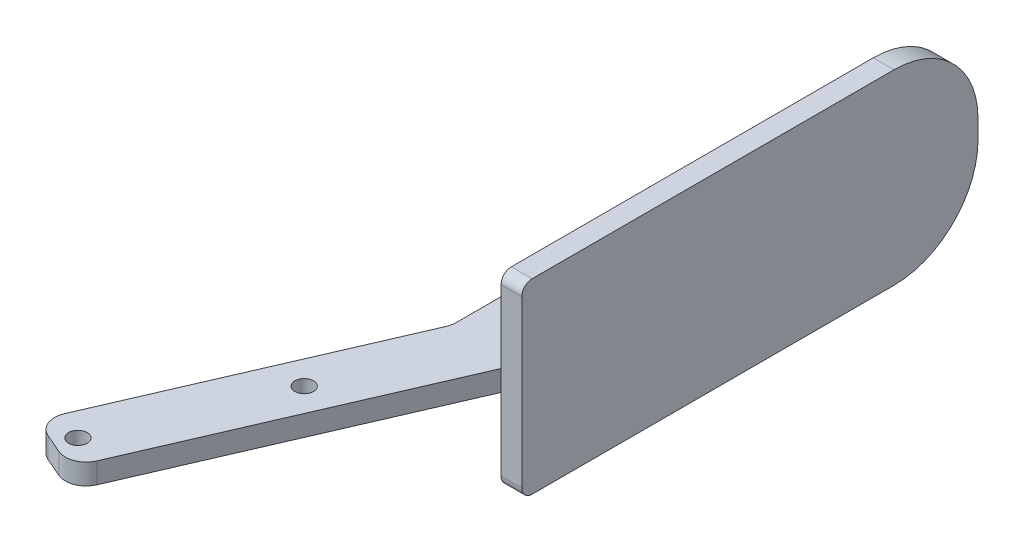
ISO-10303-21;
HEADER;
FILE_DESCRIPTION(('STEP AP214'),'2;1');
FILE_NAME('part.step','',(''),(''),'','','');
FILE_SCHEMA(('AUTOMOTIVE_DESIGN { 1 0 10303 214 1 1 1 1 }'));
ENDSEC;
DATA;
#1=APPLICATION_CONTEXT('core data for automotive mechanical design processes');
#2=APPLICATION_PROTOCOL_DEFINITION('international standard','automotive_design',2000,#1);
#3=PRODUCT_CONTEXT('',#1,'mechanical');
#4=PRODUCT('Part','Part','',(#3));
#5=PRODUCT_RELATED_PRODUCT_CATEGORY('part','',(#4));
#6=PRODUCT_DEFINITION_FORMATION('','',#4);
#7=PRODUCT_DEFINITION_CONTEXT('part definition',#1,'design');
#8=PRODUCT_DEFINITION('design','',#6,#7);
#9=PRODUCT_DEFINITION_SHAPE('','',#8);
#10=(LENGTH_UNIT() NAMED_UNIT(*) SI_UNIT(.MILLI.,.METRE.));
#11=(NAMED_UNIT(*) PLANE_ANGLE_UNIT() SI_UNIT($,.RADIAN.));
#12=(NAMED_UNIT(*) SI_UNIT($,.STERADIAN.) SOLID_ANGLE_UNIT());
#13=UNCERTAINTY_MEASURE_WITH_UNIT(LENGTH_MEASURE(1.E-05),#10,'distance_accuracy_value','');
#14=(GEOMETRIC_REPRESENTATION_CONTEXT(3) GLOBAL_UNCERTAINTY_ASSIGNED_CONTEXT((#13)) GLOBAL_UNIT_ASSIGNED_CONTEXT((#10,
#11,#12)) REPRESENTATION_CONTEXT('',''));
#15=CARTESIAN_POINT('',(0.,0.,0.));
#16=DIRECTION('',(0.,0.,1.));
#17=DIRECTION('',(1.,0.,0.));
#18=AXIS2_PLACEMENT_3D('',#15,#16,#17);
#19=CARTESIAN_POINT('',(3.175,14.2875,0.));
#20=DIRECTION('',(0.,0.,-1.));
#21=DIRECTION('',(-1.,0.,0.));
#22=AXIS2_PLACEMENT_3D('',#19,#20,#21);
#23=PLANE('',#22);
#24=DIRECTION('',(0.,-1.,0.));
#25=VECTOR('',#24,1.);
#26=CARTESIAN_POINT('',(0.,14.2875,0.));
#27=LINE('',#26,#25);
#28=CARTESIAN_POINT('',(0.,-1.5875,0.));
#29=VERTEX_POINT('',#28);
#30=CARTESIAN_POINT('',(0.,-12.7,0.));
#31=VERTEX_POINT('',#30);
#32=EDGE_CURVE('E179',#29,#31,#27,.T.);
#33=ORIENTED_EDGE('',*,*,#32,.T.);
#34=DIRECTION('',(-1.,0.,0.));
#35=VECTOR('',#34,1.);
#36=CARTESIAN_POINT('',(3.175,-12.7,0.));
#37=LINE('',#36,#35);
#38=CARTESIAN_POINT('',(3.175,-12.7,0.));
#39=VERTEX_POINT('',#38);
#40=EDGE_CURVE('E311',#31,#39,#37,.F.);
#41=ORIENTED_EDGE('',*,*,#40,.T.);
#42=DIRECTION('',(0.,-1.,0.));
#43=VECTOR('',#42,1.);
#44=CARTESIAN_POINT('',(3.175,14.2875,0.));
#45=LINE('',#44,#43);
#46=CARTESIAN_POINT('',(3.175,12.7,0.));
#47=VERTEX_POINT('',#46);
#48=EDGE_CURVE('E277',#47,#39,#45,.T.);
#49=ORIENTED_EDGE('',*,*,#48,.F.);
#50=DIRECTION('',(-1.,0.,0.));
#51=VECTOR('',#50,1.);
#52=CARTESIAN_POINT('',(3.175,12.7,0.));
#53=LINE('',#52,#51);
#54=CARTESIAN_POINT('',(0.,12.7,0.));
#55=VERTEX_POINT('',#54);
#56=EDGE_CURVE('E309',#47,#55,#53,.T.);
#57=ORIENTED_EDGE('',*,*,#56,.T.);
#58=CARTESIAN_POINT('',(0.,1.5875,0.));
#59=VERTEX_POINT('',#58);
#60=EDGE_CURVE('E260',#55,#59,#27,.T.);
#61=ORIENTED_EDGE('',*,*,#60,.T.);
#62=DIRECTION('',(0.,-1.,0.));
#63=VECTOR('',#62,1.);
#64=CARTESIAN_POINT('',(0.,1.5875,0.));
#65=LINE('',#64,#63);
#66=EDGE_CURVE('E180',#59,#29,#65,.T.);
#67=ORIENTED_EDGE('',*,*,#66,.T.);
#68=EDGE_LOOP('',(#33,#41,#49,#57,#61,#67));
#69=FACE_BOUND('',#68,.T.);
#70=ADVANCED_FACE('F37',(#69),#23,.F.);
#71=CARTESIAN_POINT('',(3.175,-14.2875,0.));
#72=DIRECTION('',(0.,1.,0.));
#73=DIRECTION('',(0.,0.,1.));
#74=AXIS2_PLACEMENT_3D('',#71,#72,#73);
#75=PLANE('',#74);
#76=DIRECTION('',(0.,0.,-1.));
#77=VECTOR('',#76,1.);
#78=CARTESIAN_POINT('',(3.175,-14.2875,0.));
#79=LINE('',#78,#77);
#80=CARTESIAN_POINT('',(3.175,-14.2875,-1.5875));
#81=VERTEX_POINT('',#80);
#82=CARTESIAN_POINT('',(3.175,-14.2875,-56.9976));
#83=VERTEX_POINT('',#82);
#84=EDGE_CURVE('E364',#81,#83,#79,.T.);
#85=ORIENTED_EDGE('',*,*,#84,.F.);
#86=DIRECTION('',(-1.,0.,0.));
#87=VECTOR('',#86,1.);
#88=CARTESIAN_POINT('',(3.175,-14.2875,-1.5875));
#89=LINE('',#88,#87);
#90=CARTESIAN_POINT('',(0.,-14.2875,-1.5875));
#91=VERTEX_POINT('',#90);
#92=EDGE_CURVE('E255',#81,#91,#89,.T.);
#93=ORIENTED_EDGE('',*,*,#92,.T.);
#94=DIRECTION('',(0.,0.,-1.));
#95=VECTOR('',#94,1.);
#96=CARTESIAN_POINT('',(0.,-14.2875,0.));
#97=LINE('',#96,#95);
#98=CARTESIAN_POINT('',(0.,-14.2875,-56.9976));
#99=VERTEX_POINT('',#98);
#100=EDGE_CURVE('E262',#91,#99,#97,.T.);
#101=ORIENTED_EDGE('',*,*,#100,.T.);
#102=DIRECTION('',(-1.,0.,0.));
#103=VECTOR('',#102,1.);
#104=CARTESIAN_POINT('',(3.175,-14.2875,-56.9976));
#105=LINE('',#104,#103);
#106=EDGE_CURVE('E288',#99,#83,#105,.F.);
#107=ORIENTED_EDGE('',*,*,#106,.T.);
#108=EDGE_LOOP('',(#85,#93,#101,#107));
#109=FACE_BOUND('',#108,.T.);
#110=ADVANCED_FACE('F382',(#109),#75,.F.);
#111=CARTESIAN_POINT('',(3.175,14.2875,-69.85));
#112=DIRECTION('',(0.,0.,1.));
#113=DIRECTION('',(1.,0.,0.));
#114=AXIS2_PLACEMENT_3D('',#111,#112,#113);
#115=PLANE('',#114);
#116=DIRECTION('',(0.,1.,0.));
#117=VECTOR('',#116,1.);
#118=CARTESIAN_POINT('',(3.175,14.2875,-69.85));
#119=LINE('',#118,#117);
#120=CARTESIAN_POINT('',(3.175,-1.4351,-69.85));
#121=VERTEX_POINT('',#120);
#122=CARTESIAN_POINT('',(3.175,1.4351,-69.85));
#123=VERTEX_POINT('',#122);
#124=EDGE_CURVE('E365',#121,#123,#119,.T.);
#125=ORIENTED_EDGE('',*,*,#124,.F.);
#126=DIRECTION('',(-1.,0.,0.));
#127=VECTOR('',#126,1.);
#128=CARTESIAN_POINT('',(3.175,-1.4351,-69.85));
#129=LINE('',#128,#127);
#130=CARTESIAN_POINT('',(0.,-1.4351,-69.85));
#131=VERTEX_POINT('',#130);
#132=EDGE_CURVE('E280',#121,#131,#129,.T.);
#133=ORIENTED_EDGE('',*,*,#132,.T.);
#134=DIRECTION('',(0.,1.,0.));
#135=VECTOR('',#134,1.);
#136=CARTESIAN_POINT('',(0.,14.2875,-69.85));
#137=LINE('',#136,#135);
#138=CARTESIAN_POINT('',(0.,1.4351,-69.85));
#139=VERTEX_POINT('',#138);
#140=EDGE_CURVE('E271',#131,#139,#137,.T.);
#141=ORIENTED_EDGE('',*,*,#140,.T.);
#142=DIRECTION('',(-1.,0.,0.));
#143=VECTOR('',#142,1.);
#144=CARTESIAN_POINT('',(3.175,1.4351,-69.85));
#145=LINE('',#144,#143);
#146=EDGE_CURVE('E278',#139,#123,#145,.F.);
#147=ORIENTED_EDGE('',*,*,#146,.T.);
#148=EDGE_LOOP('',(#125,#133,#141,#147));
#149=FACE_BOUND('',#148,.T.);
#150=ADVANCED_FACE('F389',(#149),#115,.F.);
#151=CARTESIAN_POINT('',(3.175,14.2875,0.));
#152=DIRECTION('',(0.,-1.,0.));
#153=DIRECTION('',(0.,0.,-1.));
#154=AXIS2_PLACEMENT_3D('',#151,#152,#153);
#155=PLANE('',#154);
#156=DIRECTION('',(0.,0.,1.));
#157=VECTOR('',#156,1.);
#158=CARTESIAN_POINT('',(0.,14.2875,0.));
#159=LINE('',#158,#157);
#160=CARTESIAN_POINT('',(0.,14.2875,-56.9976));
#161=VERTEX_POINT('',#160);
#162=CARTESIAN_POINT('',(0.,14.2875,-1.5875));
#163=VERTEX_POINT('',#162);
#164=EDGE_CURVE('E274',#161,#163,#159,.T.);
#165=ORIENTED_EDGE('',*,*,#164,.T.);
#166=DIRECTION('',(-1.,0.,0.));
#167=VECTOR('',#166,1.);
#168=CARTESIAN_POINT('',(3.175,14.2875,-1.5875));
#169=LINE('',#168,#167);
#170=CARTESIAN_POINT('',(3.175,14.2875,-1.5875));
#171=VERTEX_POINT('',#170);
#172=EDGE_CURVE('E319',#163,#171,#169,.F.);
#173=ORIENTED_EDGE('',*,*,#172,.T.);
#174=DIRECTION('',(0.,0.,1.));
#175=VECTOR('',#174,1.);
#176=CARTESIAN_POINT('',(3.175,14.2875,0.));
#177=LINE('',#176,#175);
#178=CARTESIAN_POINT('',(3.175,14.2875,-56.9976));
#179=VERTEX_POINT('',#178);
#180=EDGE_CURVE('E267',#179,#171,#177,.T.);
#181=ORIENTED_EDGE('',*,*,#180,.F.);
#182=DIRECTION('',(-1.,0.,0.));
#183=VECTOR('',#182,1.);
#184=CARTESIAN_POINT('',(3.175,14.2875,-56.9976));
#185=LINE('',#184,#183);
#186=EDGE_CURVE('E259',#179,#161,#185,.T.);
#187=ORIENTED_EDGE('',*,*,#186,.T.);
#188=EDGE_LOOP('',(#165,#173,#181,#187));
#189=FACE_BOUND('',#188,.T.);
#190=ADVANCED_FACE('F299',(#189),#155,.F.);
#191=CARTESIAN_POINT('',(3.175,-14.2875,0.));
#192=DIRECTION('',(1.,0.,0.));
#193=DIRECTION('',(0.,0.,-1.));
#194=AXIS2_PLACEMENT_3D('',#191,#192,#193);
#195=PLANE('',#194);
#196=ORIENTED_EDGE('',*,*,#48,.T.);
#197=CARTESIAN_POINT('',(3.175,-12.7,-1.5875));
#198=DIRECTION('',(1.,0.,0.));
#199=DIRECTION('',(0.,0.,-1.));
#200=AXIS2_PLACEMENT_3D('',#197,#198,#199);
#201=CIRCLE('',#200,1.5875);
#202=EDGE_CURVE('E317',#39,#81,#201,.T.);
#203=ORIENTED_EDGE('',*,*,#202,.T.);
#204=ORIENTED_EDGE('',*,*,#84,.T.);
#205=CARTESIAN_POINT('',(3.175,-1.4351,-56.9976));
#206=DIRECTION('',(1.,0.,0.));
#207=DIRECTION('',(0.,0.,-1.));
#208=AXIS2_PLACEMENT_3D('',#205,#206,#207);
#209=CIRCLE('',#208,12.8524);
#210=EDGE_CURVE('E293',#83,#121,#209,.T.);
#211=ORIENTED_EDGE('',*,*,#210,.T.);
#212=ORIENTED_EDGE('',*,*,#124,.T.);
#213=CARTESIAN_POINT('',(3.175,1.4351,-56.9976));
#214=DIRECTION('',(1.,0.,0.));
#215=DIRECTION('',(0.,0.,-1.));
#216=AXIS2_PLACEMENT_3D('',#213,#214,#215);
#217=CIRCLE('',#216,12.8524);
#218=EDGE_CURVE('E291',#123,#179,#217,.T.);
#219=ORIENTED_EDGE('',*,*,#218,.T.);
#220=ORIENTED_EDGE('',*,*,#180,.T.);
#221=CARTESIAN_POINT('',(3.175,12.7,-1.5875));
#222=DIRECTION('',(1.,0.,0.));
#223=DIRECTION('',(0.,0.,-1.));
#224=AXIS2_PLACEMENT_3D('',#221,#222,#223);
#225=CIRCLE('',#224,1.5875);
#226=EDGE_CURVE('E315',#171,#47,#225,.T.);
#227=ORIENTED_EDGE('',*,*,#226,.T.);
#228=EDGE_LOOP('',(#196,#203,#204,#211,#212,#219,#220,#227));
#229=FACE_BOUND('',#228,.T.);
#230=ADVANCED_FACE('F370',(#229),#195,.T.);
#231=CARTESIAN_POINT('',(0.,-14.2875,0.));
#232=DIRECTION('',(1.,0.,0.));
#233=DIRECTION('',(0.,0.,-1.));
#234=AXIS2_PLACEMENT_3D('',#231,#232,#233);
#235=PLANE('',#234);
#236=ORIENTED_EDGE('',*,*,#100,.F.);
#237=CARTESIAN_POINT('',(0.,-12.7,-1.5875));
#238=DIRECTION('',(1.,0.,0.));
#239=DIRECTION('',(0.,0.,-1.));
#240=AXIS2_PLACEMENT_3D('',#237,#238,#239);
#241=CIRCLE('',#240,1.5875);
#242=EDGE_CURVE('E308',#91,#31,#241,.F.);
#243=ORIENTED_EDGE('',*,*,#242,.T.);
#244=ORIENTED_EDGE('',*,*,#32,.F.);
#245=DIRECTION('',(0.,0.,-1.));
#246=VECTOR('',#245,1.);
#247=CARTESIAN_POINT('',(0.,-1.5875,-55.499));
#248=LINE('',#247,#246);
#249=CARTESIAN_POINT('',(0.,-1.5875,-55.499));
#250=VERTEX_POINT('',#249);
#251=EDGE_CURVE('E175',#29,#250,#248,.T.);
#252=ORIENTED_EDGE('',*,*,#251,.T.);
#253=DIRECTION('',(0.,-1.,0.));
#254=VECTOR('',#253,1.);
#255=CARTESIAN_POINT('',(0.,1.5875,-55.499));
#256=LINE('',#255,#254);
#257=CARTESIAN_POINT('',(0.,1.5875,-55.499));
#258=VERTEX_POINT('',#257);
#259=EDGE_CURVE('E165',#258,#250,#256,.T.);
#260=ORIENTED_EDGE('',*,*,#259,.F.);
#261=DIRECTION('',(0.,0.,-1.));
#262=VECTOR('',#261,1.);
#263=CARTESIAN_POINT('',(0.,1.5875,-55.499));
#264=LINE('',#263,#262);
#265=EDGE_CURVE('E171',#59,#258,#264,.T.);
#266=ORIENTED_EDGE('',*,*,#265,.F.);
#267=ORIENTED_EDGE('',*,*,#60,.F.);
#268=CARTESIAN_POINT('',(0.,12.7,-1.5875));
#269=DIRECTION('',(1.,0.,0.));
#270=DIRECTION('',(0.,0.,-1.));
#271=AXIS2_PLACEMENT_3D('',#268,#269,#270);
#272=CIRCLE('',#271,1.5875);
#273=EDGE_CURVE('E258',#55,#163,#272,.F.);
#274=ORIENTED_EDGE('',*,*,#273,.T.);
#275=ORIENTED_EDGE('',*,*,#164,.F.);
#276=CARTESIAN_POINT('',(0.,1.4351,-56.9976));
#277=DIRECTION('',(1.,0.,0.));
#278=DIRECTION('',(0.,0.,-1.));
#279=AXIS2_PLACEMENT_3D('',#276,#277,#278);
#280=CIRCLE('',#279,12.8524);
#281=EDGE_CURVE('E283',#161,#139,#280,.F.);
#282=ORIENTED_EDGE('',*,*,#281,.T.);
#283=ORIENTED_EDGE('',*,*,#140,.F.);
#284=CARTESIAN_POINT('',(0.,-1.4351,-56.9976));
#285=DIRECTION('',(1.,0.,0.));
#286=DIRECTION('',(0.,0.,-1.));
#287=AXIS2_PLACEMENT_3D('',#284,#285,#286);
#288=CIRCLE('',#287,12.8524);
#289=EDGE_CURVE('E285',#131,#99,#288,.F.);
#290=ORIENTED_EDGE('',*,*,#289,.T.);
#291=EDGE_LOOP('',(#236,#243,#244,#252,#260,#266,#267,#274,#275,#282,#283,#290));
#292=FACE_BOUND('',#291,.T.);
#293=ADVANCED_FACE('F168',(#292),#235,.F.);
#294=CARTESIAN_POINT('',(3.175,-1.4351,-56.9976));
#295=DIRECTION('',(-1.,0.,0.));
#296=DIRECTION('',(0.,0.,1.));
#297=AXIS2_PLACEMENT_3D('',#294,#295,#296);
#298=CYLINDRICAL_SURFACE('',#297,12.8524);
#299=ORIENTED_EDGE('',*,*,#210,.F.);
#300=ORIENTED_EDGE('',*,*,#106,.F.);
#301=ORIENTED_EDGE('',*,*,#289,.F.);
#302=ORIENTED_EDGE('',*,*,#132,.F.);
#303=EDGE_LOOP('',(#299,#300,#301,#302));
#304=FACE_BOUND('',#303,.T.);
#305=ADVANCED_FACE('F387',(#304),#298,.T.);
#306=CARTESIAN_POINT('',(3.175,1.4351,-56.9976));
#307=DIRECTION('',(-1.,0.,0.));
#308=DIRECTION('',(0.,0.,1.));
#309=AXIS2_PLACEMENT_3D('',#306,#307,#308);
#310=CYLINDRICAL_SURFACE('',#309,12.8524);
#311=ORIENTED_EDGE('',*,*,#218,.F.);
#312=ORIENTED_EDGE('',*,*,#146,.F.);
#313=ORIENTED_EDGE('',*,*,#281,.F.);
#314=ORIENTED_EDGE('',*,*,#186,.F.);
#315=EDGE_LOOP('',(#311,#312,#313,#314));
#316=FACE_BOUND('',#315,.T.);
#317=ADVANCED_FACE('F391',(#316),#310,.T.);
#318=CARTESIAN_POINT('',(-9.525,1.5875,-55.499));
#319=DIRECTION('',(0.,0.,1.));
#320=DIRECTION('',(1.,0.,0.));
#321=AXIS2_PLACEMENT_3D('',#318,#319,#320);
#322=PLANE('',#321);
#323=DIRECTION('',(-1.,0.,0.));
#324=VECTOR('',#323,1.);
#325=CARTESIAN_POINT('',(-9.525,-1.5875,-55.499));
#326=LINE('',#325,#324);
#327=CARTESIAN_POINT('',(-6.35,-1.5875,-55.499));
#328=VERTEX_POINT('',#327);
#329=EDGE_CURVE('E233',#250,#328,#326,.T.);
#330=ORIENTED_EDGE('',*,*,#329,.T.);
#331=DIRECTION('',(0.,-1.,0.));
#332=VECTOR('',#331,1.);
#333=CARTESIAN_POINT('',(-6.35,1.5875,-55.499));
#334=LINE('',#333,#332);
#335=CARTESIAN_POINT('',(-6.35,1.5875,-55.499));
#336=VERTEX_POINT('',#335);
#337=EDGE_CURVE('E186',#328,#336,#334,.F.);
#338=ORIENTED_EDGE('',*,*,#337,.T.);
#339=DIRECTION('',(-1.,0.,0.));
#340=VECTOR('',#339,1.);
#341=CARTESIAN_POINT('',(-9.525,1.5875,-55.499));
#342=LINE('',#341,#340);
#343=EDGE_CURVE('E183',#258,#336,#342,.T.);
#344=ORIENTED_EDGE('',*,*,#343,.F.);
#345=ORIENTED_EDGE('',*,*,#259,.T.);
#346=EDGE_LOOP('',(#330,#338,#344,#345));
#347=FACE_BOUND('',#346,.T.);
#348=ADVANCED_FACE('F184',(#347),#322,.F.);
#349=CARTESIAN_POINT('',(-9.525,1.5875,-1.97257759827113));
#350=DIRECTION('',(1.,0.,0.));
#351=DIRECTION('',(0.,0.,-1.));
#352=AXIS2_PLACEMENT_3D('',#349,#350,#351);
#353=PLANE('',#352);
#354=DIRECTION('',(0.,0.,1.));
#355=VECTOR('',#354,1.);
#356=CARTESIAN_POINT('',(-9.525,1.5875,-1.97257759827113));
#357=LINE('',#356,#355);
#358=CARTESIAN_POINT('',(-9.525,1.5875,-52.324));
#359=VERTEX_POINT('',#358);
#360=CARTESIAN_POINT('',(-9.525,1.5875,-2.6301034643615));
#361=VERTEX_POINT('',#360);
#362=EDGE_CURVE('E188',#359,#361,#357,.T.);
#363=ORIENTED_EDGE('',*,*,#362,.F.);
#364=DIRECTION('',(0.,-1.,0.));
#365=VECTOR('',#364,1.);
#366=CARTESIAN_POINT('',(-9.525,1.5875,-52.324));
#367=LINE('',#366,#365);
#368=CARTESIAN_POINT('',(-9.525,-1.5875,-52.324));
#369=VERTEX_POINT('',#368);
#370=EDGE_CURVE('E323',#359,#369,#367,.T.);
#371=ORIENTED_EDGE('',*,*,#370,.T.);
#372=DIRECTION('',(0.,0.,1.));
#373=VECTOR('',#372,1.);
#374=CARTESIAN_POINT('',(-9.525,-1.5875,-1.97257759827113));
#375=LINE('',#374,#373);
#376=CARTESIAN_POINT('',(-9.525,-1.5875,-2.6301034643615));
#377=VERTEX_POINT('',#376);
#378=EDGE_CURVE('E334',#369,#377,#375,.T.);
#379=ORIENTED_EDGE('',*,*,#378,.T.);
#380=DIRECTION('',(0.,-1.,0.));
#381=VECTOR('',#380,1.);
#382=CARTESIAN_POINT('',(-9.525,1.5875,-2.6301034643615));
#383=LINE('',#382,#381);
#384=EDGE_CURVE('E321',#377,#361,#383,.F.);
#385=ORIENTED_EDGE('',*,*,#384,.T.);
#386=EDGE_LOOP('',(#363,#371,#379,#385));
#387=FACE_BOUND('',#386,.T.);
#388=ADVANCED_FACE('F341',(#387),#353,.F.);
#389=CARTESIAN_POINT('',(-28.6917578193364,1.5875,42.3180872724994));
#390=DIRECTION('',(0.917751033376927,0.,0.397156191863581));
#391=DIRECTION('',(0.397156191863581,0.,-0.917751033376927));
#392=AXIS2_PLACEMENT_3D('',#389,#390,#391);
#393=PLANE('',#392);
#394=DIRECTION('',(-0.397156191863581,0.,0.917751033376927));
#395=VECTOR('',#394,1.);
#396=CARTESIAN_POINT('',(-28.6917578193364,1.5875,42.3180872724994));
#397=LINE('',#396,#395);
#398=CARTESIAN_POINT('',(-9.78614046902826,1.5875,-1.36913255519462));
#399=VERTEX_POINT('',#398);
#400=CARTESIAN_POINT('',(-27.4307869101696,1.5875,39.4042277415276));
#401=VERTEX_POINT('',#400);
#402=EDGE_CURVE('E245',#399,#401,#397,.T.);
#403=ORIENTED_EDGE('',*,*,#402,.F.);
#404=DIRECTION('',(0.,-1.,0.));
#405=VECTOR('',#404,1.);
#406=CARTESIAN_POINT('',(-9.78614046902826,-1.5875,-1.36913255519463));
#407=LINE('',#406,#405);
#408=CARTESIAN_POINT('',(-9.78614046902826,-1.5875,-1.36913255519462));
#409=VERTEX_POINT('',#408);
#410=EDGE_CURVE('E218',#399,#409,#407,.T.);
#411=ORIENTED_EDGE('',*,*,#410,.T.);
#412=DIRECTION('',(-0.397156191863581,0.,0.917751033376927));
#413=VECTOR('',#412,1.);
#414=CARTESIAN_POINT('',(-28.6917578193364,-1.5875,42.3180872724994));
#415=LINE('',#414,#413);
#416=CARTESIAN_POINT('',(-27.4307869101696,-1.5875,39.4042277415276));
#417=VERTEX_POINT('',#416);
#418=EDGE_CURVE('E353',#409,#417,#415,.T.);
#419=ORIENTED_EDGE('',*,*,#418,.T.);
#420=DIRECTION('',(0.,-1.,0.));
#421=VECTOR('',#420,1.);
#422=CARTESIAN_POINT('',(-27.4307869101696,1.5875,39.4042277415276));
#423=LINE('',#422,#421);
#424=EDGE_CURVE('E216',#417,#401,#423,.F.);
#425=ORIENTED_EDGE('',*,*,#424,.T.);
#426=EDGE_LOOP('',(#403,#411,#419,#425));
#427=FACE_BOUND('',#426,.T.);
#428=ADVANCED_FACE('F349',(#427),#393,.F.);
#429=CARTESIAN_POINT('',(-19.9501792264212,1.5875,46.101));
#430=DIRECTION('',(0.397156191863581,0.,-0.917751033376928));
#431=DIRECTION('',(-0.917751033376928,0.,-0.397156191863581));
#432=AXIS2_PLACEMENT_3D('',#429,#430,#431);
#433=PLANE('',#432);
#434=DIRECTION('',(0.917751033376928,0.,0.397156191863581));
#435=VECTOR('',#434,1.);
#436=CARTESIAN_POINT('',(-19.9501792264212,-1.5875,46.101));
#437=LINE('',#436,#435);
#438=CARTESIAN_POINT('',(-25.7778982883647,-1.5875,43.5790581816663));
#439=VERTEX_POINT('',#438);
#440=CARTESIAN_POINT('',(-22.864038757393,-1.5875,44.8400290908331));
#441=VERTEX_POINT('',#440);
#442=EDGE_CURVE('E195',#439,#441,#437,.T.);
#443=ORIENTED_EDGE('',*,*,#442,.T.);
#444=DIRECTION('',(0.,-1.,0.));
#445=VECTOR('',#444,1.);
#446=CARTESIAN_POINT('',(-22.864038757393,1.5875,44.8400290908331));
#447=LINE('',#446,#445);
#448=CARTESIAN_POINT('',(-22.864038757393,1.5875,44.8400290908331));
#449=VERTEX_POINT('',#448);
#450=EDGE_CURVE('E62',#441,#449,#447,.F.);
#451=ORIENTED_EDGE('',*,*,#450,.T.);
#452=DIRECTION('',(0.917751033376928,0.,0.397156191863581));
#453=VECTOR('',#452,1.);
#454=CARTESIAN_POINT('',(-19.9501792264212,1.5875,46.101));
#455=LINE('',#454,#453);
#456=CARTESIAN_POINT('',(-25.7778982883647,1.5875,43.5790581816663));
#457=VERTEX_POINT('',#456);
#458=EDGE_CURVE('E209',#457,#449,#455,.T.);
#459=ORIENTED_EDGE('',*,*,#458,.F.);
#460=DIRECTION('',(0.,-1.,0.));
#461=VECTOR('',#460,1.);
#462=CARTESIAN_POINT('',(-25.7778982883647,1.5875,43.5790581816663));
#463=LINE('',#462,#461);
#464=EDGE_CURVE('E224',#457,#439,#463,.T.);
#465=ORIENTED_EDGE('',*,*,#464,.T.);
#466=EDGE_LOOP('',(#443,#451,#459,#465));
#467=FACE_BOUND('',#466,.T.);
#468=ADVANCED_FACE('F356',(#467),#433,.F.);
#469=CARTESIAN_POINT('',(0.,1.5875,0.));
#470=DIRECTION('',(-0.917751033376927,0.,-0.397156191863582));
#471=DIRECTION('',(-0.397156191863582,0.,0.917751033376927));
#472=AXIS2_PLACEMENT_3D('',#469,#470,#471);
#473=PLANE('',#472);
#474=DIRECTION('',(0.397156191863581,0.,-0.917751033376927));
#475=VECTOR('',#474,1.);
#476=CARTESIAN_POINT('',(0.,1.5875,0.));
#477=LINE('',#476,#475);
#478=CARTESIAN_POINT('',(-18.6892083172543,1.5875,43.1871404690283));
#479=VERTEX_POINT('',#478);
#480=EDGE_CURVE('E191',#479,#59,#477,.T.);
#481=ORIENTED_EDGE('',*,*,#480,.F.);
#482=DIRECTION('',(0.,-1.,0.));
#483=VECTOR('',#482,1.);
#484=CARTESIAN_POINT('',(-18.6892083172543,1.5875,43.1871404690283));
#485=LINE('',#484,#483);
#486=CARTESIAN_POINT('',(-18.6892083172543,-1.5875,43.1871404690283));
#487=VERTEX_POINT('',#486);
#488=EDGE_CURVE('E221',#479,#487,#485,.T.);
#489=ORIENTED_EDGE('',*,*,#488,.T.);
#490=DIRECTION('',(0.397156191863581,0.,-0.917751033376927));
#491=VECTOR('',#490,1.);
#492=CARTESIAN_POINT('',(0.,-1.5875,0.));
#493=LINE('',#492,#491);
#494=EDGE_CURVE('E193',#487,#29,#493,.T.);
#495=ORIENTED_EDGE('',*,*,#494,.T.);
#496=ORIENTED_EDGE('',*,*,#66,.F.);
#497=EDGE_LOOP('',(#481,#489,#495,#496));
#498=FACE_BOUND('',#497,.T.);
#499=ADVANCED_FACE('F422',(#498),#473,.F.);
#500=CARTESIAN_POINT('',(0.,1.5875,-55.499));
#501=DIRECTION('',(0.,1.,0.));
#502=DIRECTION('',(0.,0.,1.));
#503=AXIS2_PLACEMENT_3D('',#500,#501,#502);
#504=PLANE('',#503);
#505=CARTESIAN_POINT('',(-12.7250800421803,1.5875,17.4136913894335));
#506=DIRECTION('',(0.,1.,0.));
#507=DIRECTION('',(0.,0.,1.));
#508=AXIS2_PLACEMENT_3D('',#505,#506,#507);
#509=CIRCLE('',#508,1.42240000000001);
#510=CARTESIAN_POINT('',(-12.7250800421803,1.5875,18.8360913894335));
#511=VERTEX_POINT('',#510);
#512=EDGE_CURVE('E240',#511,#511,#509,.T.);
#513=ORIENTED_EDGE('',*,*,#512,.F.);
#514=EDGE_LOOP('',(#513));
#515=FACE_BOUND('',#514,.T.);
#516=CARTESIAN_POINT('',(-23.1911385882653,1.5875,41.598725496499));
#517=DIRECTION('',(0.,1.,0.));
#518=DIRECTION('',(0.,0.,1.));
#519=AXIS2_PLACEMENT_3D('',#516,#517,#518);
#520=CIRCLE('',#519,1.42240000000001);
#521=CARTESIAN_POINT('',(-23.1911385882653,1.5875,43.021125496499));
#522=VERTEX_POINT('',#521);
#523=EDGE_CURVE('E230',#522,#522,#520,.T.);
#524=ORIENTED_EDGE('',*,*,#523,.F.);
#525=EDGE_LOOP('',(#524));
#526=FACE_BOUND('',#525,.T.);
#527=ORIENTED_EDGE('',*,*,#343,.T.);
#528=CARTESIAN_POINT('',(-6.35,1.5875,-52.324));
#529=DIRECTION('',(0.,1.,0.));
#530=DIRECTION('',(0.,0.,1.));
#531=AXIS2_PLACEMENT_3D('',#528,#529,#530);
#532=CIRCLE('',#531,3.175);
#533=EDGE_CURVE('E214',#336,#359,#532,.T.);
#534=ORIENTED_EDGE('',*,*,#533,.T.);
#535=ORIENTED_EDGE('',*,*,#362,.T.);
#536=CARTESIAN_POINT('',(-12.7,1.5875,-2.6301034643615));
#537=DIRECTION('',(0.,1.,0.));
#538=DIRECTION('',(0.,0.,1.));
#539=AXIS2_PLACEMENT_3D('',#536,#537,#538);
#540=CIRCLE('',#539,3.175);
#541=EDGE_CURVE('E11',#361,#399,#540,.F.);
#542=ORIENTED_EDGE('',*,*,#541,.T.);
#543=ORIENTED_EDGE('',*,*,#402,.T.);
#544=CARTESIAN_POINT('',(-24.5169273791978,1.5875,40.6651986506945));
#545=DIRECTION('',(0.,1.,0.));
#546=DIRECTION('',(0.,0.,1.));
#547=AXIS2_PLACEMENT_3D('',#544,#545,#546);
#548=CIRCLE('',#547,3.175);
#549=EDGE_CURVE('E211',#401,#457,#548,.T.);
#550=ORIENTED_EDGE('',*,*,#549,.T.);
#551=ORIENTED_EDGE('',*,*,#458,.T.);
#552=CARTESIAN_POINT('',(-21.6030678482261,1.5875,41.9261695598614));
#553=DIRECTION('',(0.,1.,0.));
#554=DIRECTION('',(0.,0.,1.));
#555=AXIS2_PLACEMENT_3D('',#552,#553,#554);
#556=CIRCLE('',#555,3.175);
#557=EDGE_CURVE('E54',#449,#479,#556,.T.);
#558=ORIENTED_EDGE('',*,*,#557,.T.);
#559=ORIENTED_EDGE('',*,*,#480,.T.);
#560=ORIENTED_EDGE('',*,*,#265,.T.);
#561=EDGE_LOOP('',(#527,#534,#535,#542,#543,#550,#551,#558,#559,#560));
#562=FACE_BOUND('',#561,.T.);
#563=ADVANCED_FACE('F190',(#515,#526,#562),#504,.T.);
#564=CARTESIAN_POINT('',(0.,-1.5875,-55.499));
#565=DIRECTION('',(0.,1.,0.));
#566=DIRECTION('',(0.,0.,1.));
#567=AXIS2_PLACEMENT_3D('',#564,#565,#566);
#568=PLANE('',#567);
#569=CARTESIAN_POINT('',(-12.7250800421803,-1.5875,17.4136913894335));
#570=DIRECTION('',(0.,1.,0.));
#571=DIRECTION('',(0.,0.,1.));
#572=AXIS2_PLACEMENT_3D('',#569,#570,#571);
#573=CIRCLE('',#572,1.42240000000001);
#574=CARTESIAN_POINT('',(-12.7250800421803,-1.5875,18.8360913894335));
#575=VERTEX_POINT('',#574);
#576=EDGE_CURVE('E41',#575,#575,#573,.T.);
#577=ORIENTED_EDGE('',*,*,#576,.T.);
#578=EDGE_LOOP('',(#577));
#579=FACE_BOUND('',#578,.T.);
#580=CARTESIAN_POINT('',(-23.1911385882653,-1.5875,41.598725496499));
#581=DIRECTION('',(0.,1.,0.));
#582=DIRECTION('',(0.,0.,1.));
#583=AXIS2_PLACEMENT_3D('',#580,#581,#582);
#584=CIRCLE('',#583,1.42240000000001);
#585=CARTESIAN_POINT('',(-23.1911385882653,-1.5875,43.021125496499));
#586=VERTEX_POINT('',#585);
#587=EDGE_CURVE('E228',#586,#586,#584,.T.);
#588=ORIENTED_EDGE('',*,*,#587,.T.);
#589=EDGE_LOOP('',(#588));
#590=FACE_BOUND('',#589,.T.);
#591=ORIENTED_EDGE('',*,*,#378,.F.);
#592=CARTESIAN_POINT('',(-6.35,-1.5875,-52.324));
#593=DIRECTION('',(0.,1.,0.));
#594=DIRECTION('',(0.,0.,1.));
#595=AXIS2_PLACEMENT_3D('',#592,#593,#594);
#596=CIRCLE('',#595,3.175);
#597=EDGE_CURVE('E329',#369,#328,#596,.F.);
#598=ORIENTED_EDGE('',*,*,#597,.T.);
#599=ORIENTED_EDGE('',*,*,#329,.F.);
#600=ORIENTED_EDGE('',*,*,#251,.F.);
#601=ORIENTED_EDGE('',*,*,#494,.F.);
#602=CARTESIAN_POINT('',(-21.6030678482261,-1.5875,41.9261695598614));
#603=DIRECTION('',(0.,1.,0.));
#604=DIRECTION('',(0.,0.,1.));
#605=AXIS2_PLACEMENT_3D('',#602,#603,#604);
#606=CIRCLE('',#605,3.175);
#607=EDGE_CURVE('E328',#487,#441,#606,.F.);
#608=ORIENTED_EDGE('',*,*,#607,.T.);
#609=ORIENTED_EDGE('',*,*,#442,.F.);
#610=CARTESIAN_POINT('',(-24.5169273791978,-1.5875,40.6651986506945));
#611=DIRECTION('',(0.,1.,0.));
#612=DIRECTION('',(0.,0.,1.));
#613=AXIS2_PLACEMENT_3D('',#610,#611,#612);
#614=CIRCLE('',#613,3.175);
#615=EDGE_CURVE('E325',#439,#417,#614,.F.);
#616=ORIENTED_EDGE('',*,*,#615,.T.);
#617=ORIENTED_EDGE('',*,*,#418,.F.);
#618=CARTESIAN_POINT('',(-12.7,-1.5875,-2.6301034643615));
#619=DIRECTION('',(0.,1.,0.));
#620=DIRECTION('',(0.,0.,1.));
#621=AXIS2_PLACEMENT_3D('',#618,#619,#620);
#622=CIRCLE('',#621,3.175);
#623=EDGE_CURVE('E46',#409,#377,#622,.T.);
#624=ORIENTED_EDGE('',*,*,#623,.T.);
#625=EDGE_LOOP('',(#591,#598,#599,#600,#601,#608,#609,#616,#617,#624));
#626=FACE_BOUND('',#625,.T.);
#627=ADVANCED_FACE('F332',(#579,#590,#626),#568,.F.);
#628=CARTESIAN_POINT('',(3.175,-12.7,-1.5875));
#629=DIRECTION('',(-1.,0.,0.));
#630=DIRECTION('',(0.,0.,1.));
#631=AXIS2_PLACEMENT_3D('',#628,#629,#630);
#632=CYLINDRICAL_SURFACE('',#631,1.5875);
#633=ORIENTED_EDGE('',*,*,#202,.F.);
#634=ORIENTED_EDGE('',*,*,#40,.F.);
#635=ORIENTED_EDGE('',*,*,#242,.F.);
#636=ORIENTED_EDGE('',*,*,#92,.F.);
#637=EDGE_LOOP('',(#633,#634,#635,#636));
#638=FACE_BOUND('',#637,.T.);
#639=ADVANCED_FACE('F380',(#638),#632,.T.);
#640=CARTESIAN_POINT('',(3.175,12.7,-1.5875));
#641=DIRECTION('',(-1.,0.,0.));
#642=DIRECTION('',(0.,0.,1.));
#643=AXIS2_PLACEMENT_3D('',#640,#641,#642);
#644=CYLINDRICAL_SURFACE('',#643,1.5875);
#645=ORIENTED_EDGE('',*,*,#226,.F.);
#646=ORIENTED_EDGE('',*,*,#172,.F.);
#647=ORIENTED_EDGE('',*,*,#273,.F.);
#648=ORIENTED_EDGE('',*,*,#56,.F.);
#649=EDGE_LOOP('',(#645,#646,#647,#648));
#650=FACE_BOUND('',#649,.T.);
#651=ADVANCED_FACE('F372',(#650),#644,.T.);
#652=CARTESIAN_POINT('',(-6.35,1.5875,-52.324));
#653=DIRECTION('',(0.,-1.,0.));
#654=DIRECTION('',(0.,0.,-1.));
#655=AXIS2_PLACEMENT_3D('',#652,#653,#654);
#656=CYLINDRICAL_SURFACE('',#655,3.175);
#657=ORIENTED_EDGE('',*,*,#533,.F.);
#658=ORIENTED_EDGE('',*,*,#337,.F.);
#659=ORIENTED_EDGE('',*,*,#597,.F.);
#660=ORIENTED_EDGE('',*,*,#370,.F.);
#661=EDGE_LOOP('',(#657,#658,#659,#660));
#662=FACE_BOUND('',#661,.T.);
#663=ADVANCED_FACE('F337',(#662),#656,.T.);
#664=CARTESIAN_POINT('',(-12.7,1.5875,-2.6301034643615));
#665=DIRECTION('',(0.,1.,0.));
#666=DIRECTION('',(0.,0.,1.));
#667=AXIS2_PLACEMENT_3D('',#664,#665,#666);
#668=CYLINDRICAL_SURFACE('',#667,3.175);
#669=ORIENTED_EDGE('',*,*,#541,.F.);
#670=ORIENTED_EDGE('',*,*,#384,.F.);
#671=ORIENTED_EDGE('',*,*,#623,.F.);
#672=ORIENTED_EDGE('',*,*,#410,.F.);
#673=EDGE_LOOP('',(#669,#670,#671,#672));
#674=FACE_BOUND('',#673,.T.);
#675=ADVANCED_FACE('F344',(#674),#668,.F.);
#676=CARTESIAN_POINT('',(-21.6030678482261,1.5875,41.9261695598614));
#677=DIRECTION('',(0.,-1.,0.));
#678=DIRECTION('',(0.,0.,-1.));
#679=AXIS2_PLACEMENT_3D('',#676,#677,#678);
#680=CYLINDRICAL_SURFACE('',#679,3.175);
#681=ORIENTED_EDGE('',*,*,#557,.F.);
#682=ORIENTED_EDGE('',*,*,#450,.F.);
#683=ORIENTED_EDGE('',*,*,#607,.F.);
#684=ORIENTED_EDGE('',*,*,#488,.F.);
#685=EDGE_LOOP('',(#681,#682,#683,#684));
#686=FACE_BOUND('',#685,.T.);
#687=ADVANCED_FACE('F457',(#686),#680,.T.);
#688=CARTESIAN_POINT('',(-24.5169273791978,1.5875,40.6651986506945));
#689=DIRECTION('',(0.,-1.,0.));
#690=DIRECTION('',(0.,0.,-1.));
#691=AXIS2_PLACEMENT_3D('',#688,#689,#690);
#692=CYLINDRICAL_SURFACE('',#691,3.175);
#693=ORIENTED_EDGE('',*,*,#549,.F.);
#694=ORIENTED_EDGE('',*,*,#424,.F.);
#695=ORIENTED_EDGE('',*,*,#615,.F.);
#696=ORIENTED_EDGE('',*,*,#464,.F.);
#697=EDGE_LOOP('',(#693,#694,#695,#696));
#698=FACE_BOUND('',#697,.T.);
#699=ADVANCED_FACE('F39',(#698),#692,.T.);
#700=CARTESIAN_POINT('',(-23.1911385882653,1.5875,41.598725496499));
#701=DIRECTION('',(0.,1.,0.));
#702=DIRECTION('',(0.,0.,1.));
#703=AXIS2_PLACEMENT_3D('',#700,#701,#702);
#704=CYLINDRICAL_SURFACE('',#703,1.42240000000001);
#705=ORIENTED_EDGE('',*,*,#523,.T.);
#706=EDGE_LOOP('',(#705));
#707=FACE_BOUND('',#706,.T.);
#708=ORIENTED_EDGE('',*,*,#587,.F.);
#709=EDGE_LOOP('',(#708));
#710=FACE_BOUND('',#709,.T.);
#711=ADVANCED_FACE('F432',(#707,#710),#704,.F.);
#712=CARTESIAN_POINT('',(-12.7250800421803,1.5875,17.4136913894335));
#713=DIRECTION('',(0.,1.,0.));
#714=DIRECTION('',(0.,0.,1.));
#715=AXIS2_PLACEMENT_3D('',#712,#713,#714);
#716=CYLINDRICAL_SURFACE('',#715,1.42240000000001);
#717=ORIENTED_EDGE('',*,*,#512,.T.);
#718=EDGE_LOOP('',(#717));
#719=FACE_BOUND('',#718,.T.);
#720=ORIENTED_EDGE('',*,*,#576,.F.);
#721=EDGE_LOOP('',(#720));
#722=FACE_BOUND('',#721,.T.);
#723=ADVANCED_FACE('F435',(#719,#722),#716,.F.);
#724=CLOSED_SHELL('',(#70,#110,#150,#190,#230,#293,#305,#317,#348,#388,#428,#468,#499,#563,#627,
#639,#651,#663,#675,#687,#699,#711,#723));
#725=MANIFOLD_SOLID_BREP('B2',#724);
#726=ADVANCED_BREP_SHAPE_REPRESENTATION('',(#18,#725),#14);
#727=SHAPE_DEFINITION_REPRESENTATION(#9,#726);
ENDSEC;
END-ISO-10303-21;
